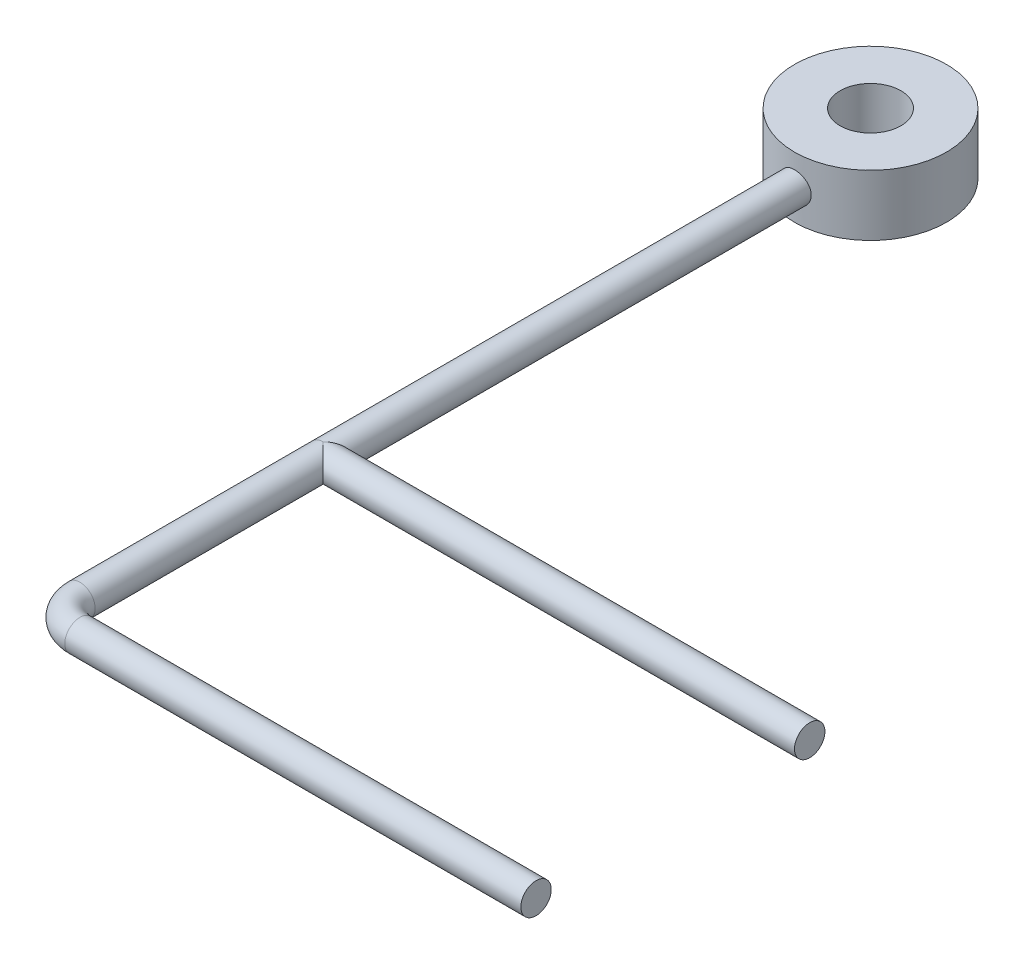
ISO-10303-21;
HEADER;
FILE_DESCRIPTION(('STEP AP214'),'2;1');
FILE_NAME('part.step','',(''),(''),'','','');
FILE_SCHEMA(('AUTOMOTIVE_DESIGN { 1 0 10303 214 1 1 1 1 }'));
ENDSEC;
DATA;
#1=APPLICATION_CONTEXT('core data for automotive mechanical design processes');
#2=APPLICATION_PROTOCOL_DEFINITION('international standard','automotive_design',2000,#1);
#3=PRODUCT_CONTEXT('',#1,'mechanical');
#4=PRODUCT('Part','Part','',(#3));
#5=PRODUCT_RELATED_PRODUCT_CATEGORY('part','',(#4));
#6=PRODUCT_DEFINITION_FORMATION('','',#4);
#7=PRODUCT_DEFINITION_CONTEXT('part definition',#1,'design');
#8=PRODUCT_DEFINITION('design','',#6,#7);
#9=PRODUCT_DEFINITION_SHAPE('','',#8);
#10=(LENGTH_UNIT() NAMED_UNIT(*) SI_UNIT(.MILLI.,.METRE.));
#11=(NAMED_UNIT(*) PLANE_ANGLE_UNIT() SI_UNIT($,.RADIAN.));
#12=(NAMED_UNIT(*) SI_UNIT($,.STERADIAN.) SOLID_ANGLE_UNIT());
#13=UNCERTAINTY_MEASURE_WITH_UNIT(LENGTH_MEASURE(1.E-05),#10,'distance_accuracy_value','');
#14=(GEOMETRIC_REPRESENTATION_CONTEXT(3) GLOBAL_UNCERTAINTY_ASSIGNED_CONTEXT((#13)) GLOBAL_UNIT_ASSIGNED_CONTEXT((#10,
#11,#12)) REPRESENTATION_CONTEXT('',''));
#15=CARTESIAN_POINT('',(0.,0.,0.));
#16=DIRECTION('',(0.,0.,1.));
#17=DIRECTION('',(1.,0.,0.));
#18=AXIS2_PLACEMENT_3D('',#15,#16,#17);
#19=CARTESIAN_POINT('',(80.,0.,135.));
#20=DIRECTION('',(1.,0.,0.));
#21=DIRECTION('',(0.,0.,-1.));
#22=AXIS2_PLACEMENT_3D('',#19,#20,#21);
#23=PLANE('',#22);
#24=CARTESIAN_POINT('',(80.,0.,135.));
#25=DIRECTION('',(1.,0.,0.));
#26=DIRECTION('',(0.,0.,-1.));
#27=AXIS2_PLACEMENT_3D('',#24,#25,#26);
#28=CIRCLE('',#27,2.5);
#29=CARTESIAN_POINT('',(80.,0.,132.5));
#30=VERTEX_POINT('',#29);
#31=EDGE_CURVE('E69',#30,#30,#28,.T.);
#32=ORIENTED_EDGE('',*,*,#31,.T.);
#33=EDGE_LOOP('',(#32));
#34=FACE_BOUND('',#33,.T.);
#35=ADVANCED_FACE('F36',(#34),#23,.T.);
#36=CARTESIAN_POINT('',(0.,0.,0.));
#37=DIRECTION('',(0.,0.,1.));
#38=DIRECTION('',(1.,0.,0.));
#39=AXIS2_PLACEMENT_3D('',#36,#37,#38);
#40=CYLINDRICAL_SURFACE('',#39,2.5);
#41=CARTESIAN_POINT('',(2.5,0.,12.2474487139159));
#42=CARTESIAN_POINT('',(2.49999486468817,-0.138910938727889,12.2474514756662));
#43=CARTESIAN_POINT('',(2.48838292929536,-0.27788655833335,12.2498377067175));
#44=CARTESIAN_POINT('',(2.4422807089571,-0.551906262857828,12.2591107826219));
#45=CARTESIAN_POINT('',(2.40777211767623,-0.686947111589948,12.2660012286197));
#46=CARTESIAN_POINT('',(2.31698945654936,-0.949093258385525,12.2834718430464));
#47=CARTESIAN_POINT('',(2.26073703538155,-1.07620630383147,12.2940483405269));
#48=CARTESIAN_POINT('',(2.12812276917626,-1.31918711174239,12.3176949870165));
#49=CARTESIAN_POINT('',(2.05176204650287,-1.43505550134475,12.3307649968365));
#50=CARTESIAN_POINT('',(1.87994768913359,-1.65390250963465,12.3581324923563));
#51=CARTESIAN_POINT('',(1.78426413978329,-1.75669896970993,12.3724434459312));
#52=CARTESIAN_POINT('',(1.57701697255327,-1.94489383394745,12.400561807565));
#53=CARTESIAN_POINT('',(1.46545224244496,-2.03029101854298,12.4143691802708));
#54=CARTESIAN_POINT('',(1.22840338981064,-2.18197004407114,12.4400699104391));
#55=CARTESIAN_POINT('',(1.10280641918053,-2.24807878454159,12.4519455360388));
#56=CARTESIAN_POINT('',(0.842010375968179,-2.35818734262034,12.4722934220908));
#57=CARTESIAN_POINT('',(0.706812203551383,-2.40218922975247,12.480766001103));
#58=CARTESIAN_POINT('',(0.432541933196237,-2.46626798404906,12.4932580172105));
#59=CARTESIAN_POINT('',(0.293544348037036,-2.48665244392751,12.4973346572032));
#60=CARTESIAN_POINT('',(0.0140464210938425,-2.50387737959578,12.5007730295901));
#61=CARTESIAN_POINT('',(-0.126453774579606,-2.50072012411455,12.500135216319));
#62=CARTESIAN_POINT('',(-0.402855001858969,-2.47118454946111,12.4942608717129));
#63=CARTESIAN_POINT('',(-0.538793035746173,-2.44513755708038,12.489089959146));
#64=CARTESIAN_POINT('',(-0.80432906645075,-2.37108741885277,12.4748044289852));
#65=CARTESIAN_POINT('',(-0.93392680936782,-2.32308339452031,12.465689653601));
#66=CARTESIAN_POINT('',(-1.18404865800221,-2.20617489963183,12.444432400499));
#67=CARTESIAN_POINT('',(-1.30451043533475,-2.13714062223778,12.4322712043806));
#68=CARTESIAN_POINT('',(-1.53226261464939,-1.9802273069085,12.4062617368446));
#69=CARTESIAN_POINT('',(-1.6395514988125,-1.89234610057371,12.3924132713806));
#70=CARTESIAN_POINT('',(-1.83987857763364,-1.69841594472882,12.3642741091115));
#71=CARTESIAN_POINT('',(-1.93263579143407,-1.59207703317602,12.3499799114379));
#72=CARTESIAN_POINT('',(-2.09904623294201,-1.36520889387312,12.322789289969));
#73=CARTESIAN_POINT('',(-2.17269909931937,-1.24467939779201,12.3098928926137));
#74=CARTESIAN_POINT('',(-2.2989070370047,-0.992447920445486,12.2869511868231));
#75=CARTESIAN_POINT('',(-2.35141661944427,-0.860722580900844,12.2769120390887));
#76=CARTESIAN_POINT('',(-2.43347585406895,-0.590071690690021,12.2609119080318));
#77=CARTESIAN_POINT('',(-2.4630284986416,-0.451147080952289,12.2549503932107));
#78=CARTESIAN_POINT('',(-2.49791501509012,-0.172587855002388,12.2478869816957));
#79=CARTESIAN_POINT('',(-2.50365464724477,-0.0330060642241485,12.2467036764289));
#80=CARTESIAN_POINT('',(-2.49184407077684,0.245120557999208,12.2491121422213));
#81=CARTESIAN_POINT('',(-2.4742951828061,0.383665447797157,12.2527036425097));
#82=CARTESIAN_POINT('',(-2.41675552018539,0.654421600730587,12.2641808123729));
#83=CARTESIAN_POINT('',(-2.37698155209824,0.786680857589406,12.2720249753624));
#84=CARTESIAN_POINT('',(-2.27635258827129,1.04265819757185,12.2910872337916));
#85=CARTESIAN_POINT('',(-2.21549585593294,1.1663755760893,12.3023056071567));
#86=CARTESIAN_POINT('',(-2.07351035553899,1.4035327748754,12.327035149051));
#87=CARTESIAN_POINT('',(-1.99212769495688,1.51681761575206,12.3405742966226));
#88=CARTESIAN_POINT('',(-1.81173893053178,1.72827078000228,12.3683430956659));
#89=CARTESIAN_POINT('',(-1.71273101286134,1.82643754562313,12.3825728180955));
#90=CARTESIAN_POINT('',(-1.49808068374472,2.00640639796394,12.4103836467304));
#91=CARTESIAN_POINT('',(-1.38220624732407,2.08793413662499,12.4239514427171));
#92=CARTESIAN_POINT('',(-1.13816974158689,2.23036470374895,12.4486781907155));
#93=CARTESIAN_POINT('',(-1.01000818858377,2.29126839836195,12.4598372438803));
#94=CARTESIAN_POINT('',(-0.745756702060031,2.39032217936658,12.4784323515267));
#95=CARTESIAN_POINT('',(-0.609716683695195,2.42860129556563,12.4858894785651));
#96=CARTESIAN_POINT('',(-0.332973636699779,2.48172811915961,12.4963308984415));
#97=CARTESIAN_POINT('',(-0.192271171778029,2.49657864868919,12.4993157299962));
#98=CARTESIAN_POINT('',(0.0871822347590524,2.50231745240722,12.5004635113529));
#99=CARTESIAN_POINT('',(0.225924530353734,2.49361820114056,12.4987094637332));
#100=CARTESIAN_POINT('',(0.499927578289124,2.45341512363043,12.4907510890085));
#101=CARTESIAN_POINT('',(0.635188374384305,2.42191158412967,12.4845468178608));
#102=CARTESIAN_POINT('',(0.89813187436266,2.33717751977103,12.468387459123));
#103=CARTESIAN_POINT('',(1.02583110810041,2.28399655467256,12.4584409311904));
#104=CARTESIAN_POINT('',(1.27055305046517,2.15746939667222,12.435868053092));
#105=CARTESIAN_POINT('',(1.38757491441961,2.08412161023875,12.4232414911747));
#106=CARTESIAN_POINT('',(1.60965972526479,1.91795153234678,12.3964399789185));
#107=CARTESIAN_POINT('',(1.71449929028711,1.82483415904056,12.3822433354475));
#108=CARTESIAN_POINT('',(1.90720654439626,1.62237439975307,12.3540305726966));
#109=CARTESIAN_POINT('',(1.99507020802228,1.51302817630018,12.340014496968));
#110=CARTESIAN_POINT('',(2.15223054862495,1.27980170827392,12.3135835683483));
#111=CARTESIAN_POINT('',(2.22131703654522,1.15577759719687,12.3011875892806));
#112=CARTESIAN_POINT('',(2.33756012316556,0.897668066849745,12.2796309281603));
#113=CARTESIAN_POINT('',(2.3847366149354,0.763591903282023,12.2704673131246));
#114=CARTESIAN_POINT('',(2.44667284964413,0.524343861392814,12.2582420284461));
#115=CARTESIAN_POINT('',(2.46663474630921,0.420536451215105,12.2542196228652));
#116=CARTESIAN_POINT('',(2.49330004489927,0.211165113622163,12.2488219614771));
#117=CARTESIAN_POINT('',(2.5000039039066,0.105601246888829,12.2474466144105));
#118=CARTESIAN_POINT('',(2.5,0.,12.2474487139159));
#119=B_SPLINE_CURVE_WITH_KNOTS('',3,(#41,#42,#43,#44,#45,#46,#47,#48,#49,#50,#51,#52,#53,#54,
#55,#56,#57,#58,#59,#60,#61,#62,#63,#64,#65,#66,#67,#68,#69,#70,#71,#72,#73,#74,#75,#76,#77,#78,
#79,#80,#81,#82,#83,#84,#85,#86,#87,#88,#89,#90,#91,#92,#93,#94,#95,#96,#97,#98,#99,#100,#101,
#102,#103,#104,#105,#106,#107,#108,#109,#110,#111,#112,#113,#114,#115,#116,#117,#118),
.UNSPECIFIED.,.T.,.F.,(4,2,2,2,2,2,2,2,2,2,2,2,2,2,2,2,2,2,2,2,2,2,2,2,2,2,2,2,2,2,2,2,2,2,2,2,
2,2,4),(0.,0.416346159673569,0.833025598210739,1.24929124485146,1.66553366214966,
2.08705631371091,2.50860850088554,2.93383501093625,3.35902170616399,3.778606222077,
4.1981503029062,4.61171974083843,5.02530572684374,5.44149810555757,5.85773839425164,
6.28123366906207,6.70473695306799,7.1291465793194,7.5535008754006,7.97059394511482,
8.38766336321052,8.80073354458295,9.21383775885994,9.632326494363,10.0508583217552,
10.4758150433362,10.9007539157526,11.3232453394662,11.7456858672907,12.1607754353671,
12.5758597841689,12.9900004268863,13.4041738033671,13.8250288006399,14.2459834722445,
14.6714724644901,15.0965743772549,15.413095090954,15.729604892137),.UNSPECIFIED.);
#120=CARTESIAN_POINT('',(2.5,0.,12.2474487139159));
#121=VERTEX_POINT('',#120);
#122=EDGE_CURVE('E11',#121,#121,#119,.T.);
#123=ORIENTED_EDGE('',*,*,#122,.F.);
#124=EDGE_LOOP('',(#123));
#125=FACE_BOUND('',#124,.T.);
#126=CARTESIAN_POINT('',(0.,0.,90.));
#127=DIRECTION('',(0.707106781186548,0.,0.707106781186547));
#128=DIRECTION('',(-0.707106781186548,0.,0.707106781186547));
#129=AXIS2_PLACEMENT_3D('',#126,#127,#128);
#130=ELLIPSE('',#129,3.53553390593273,2.5);
#131=CARTESIAN_POINT('',(0.,-2.5,90.));
#132=VERTEX_POINT('',#131);
#133=CARTESIAN_POINT('',(0.,2.5,90.));
#134=VERTEX_POINT('',#133);
#135=EDGE_CURVE('E62',#132,#134,#130,.T.);
#136=ORIENTED_EDGE('',*,*,#135,.F.);
#137=CARTESIAN_POINT('',(0.,0.,90.));
#138=DIRECTION('',(0.,0.,1.));
#139=DIRECTION('',(1.,0.,0.));
#140=AXIS2_PLACEMENT_3D('',#137,#138,#139);
#141=CIRCLE('',#140,2.5);
#142=EDGE_CURVE('E55',#134,#132,#141,.T.);
#143=ORIENTED_EDGE('',*,*,#142,.F.);
#144=EDGE_LOOP('',(#136,#143));
#145=FACE_BOUND('',#144,.T.);
#146=ADVANCED_FACE('F64',(#125,#145),#40,.T.);
#147=CARTESIAN_POINT('',(0.,0.,90.));
#148=DIRECTION('',(0.,0.,1.));
#149=DIRECTION('',(1.,0.,0.));
#150=AXIS2_PLACEMENT_3D('',#147,#148,#149);
#151=CYLINDRICAL_SURFACE('',#150,2.5);
#152=CARTESIAN_POINT('',(0.,0.,90.));
#153=DIRECTION('',(-0.707106781186547,0.,0.707106781186548));
#154=DIRECTION('',(0.707106781186548,0.,0.707106781186547));
#155=AXIS2_PLACEMENT_3D('',#152,#153,#154);
#156=ELLIPSE('',#155,3.53553390593273,2.5);
#157=EDGE_CURVE('E48',#134,#132,#156,.F.);
#158=ORIENTED_EDGE('',*,*,#157,.F.);
#159=ORIENTED_EDGE('',*,*,#142,.T.);
#160=EDGE_LOOP('',(#158,#159));
#161=FACE_BOUND('',#160,.T.);
#162=CARTESIAN_POINT('',(0.,0.,130.));
#163=DIRECTION('',(0.,0.,1.));
#164=DIRECTION('',(1.,0.,0.));
#165=AXIS2_PLACEMENT_3D('',#162,#163,#164);
#166=CIRCLE('',#165,2.5);
#167=CARTESIAN_POINT('',(-2.5,0.,130.));
#168=VERTEX_POINT('',#167);
#169=EDGE_CURVE('E61',#168,#168,#166,.T.);
#170=ORIENTED_EDGE('',*,*,#169,.F.);
#171=EDGE_LOOP('',(#170));
#172=FACE_BOUND('',#171,.T.);
#173=ADVANCED_FACE('F57',(#161,#172),#151,.T.);
#174=CARTESIAN_POINT('',(5.,0.,130.));
#175=DIRECTION('',(0.,1.,0.));
#176=DIRECTION('',(0.,0.,1.));
#177=AXIS2_PLACEMENT_3D('',#174,#175,#176);
#178=TOROIDAL_SURFACE('',#177,5.,2.5);
#179=CARTESIAN_POINT('',(5.,0.,135.));
#180=DIRECTION('',(1.,0.,0.));
#181=DIRECTION('',(0.,0.,-1.));
#182=AXIS2_PLACEMENT_3D('',#179,#180,#181);
#183=CIRCLE('',#182,2.5);
#184=CARTESIAN_POINT('',(5.,0.,137.5));
#185=VERTEX_POINT('',#184);
#186=EDGE_CURVE('E71',#185,#185,#183,.T.);
#187=CARTESIAN_POINT('',(5.,0.,130.));
#188=DIRECTION('',(0.,1.,0.));
#189=DIRECTION('',(0.,0.,1.));
#190=AXIS2_PLACEMENT_3D('',#187,#188,#189);
#191=CIRCLE('',#190,7.5);
#192=EDGE_CURVE('',#168,#185,#191,.T.);
#193=ORIENTED_EDGE('',*,*,#169,.T.);
#194=ORIENTED_EDGE('',*,*,#186,.F.);
#195=ORIENTED_EDGE('',*,*,#192,.T.);
#196=ORIENTED_EDGE('',*,*,#192,.F.);
#197=EDGE_LOOP('',(#193,#195,#194,#196));
#198=FACE_BOUND('',#197,.T.);
#199=ADVANCED_FACE('F126',(#198),#178,.T.);
#200=CARTESIAN_POINT('',(5.,0.,135.));
#201=DIRECTION('',(1.,0.,0.));
#202=DIRECTION('',(0.,0.,-1.));
#203=AXIS2_PLACEMENT_3D('',#200,#201,#202);
#204=CYLINDRICAL_SURFACE('',#203,2.5);
#205=ORIENTED_EDGE('',*,*,#31,.F.);
#206=EDGE_LOOP('',(#205));
#207=FACE_BOUND('',#206,.T.);
#208=ORIENTED_EDGE('',*,*,#186,.T.);
#209=EDGE_LOOP('',(#208));
#210=FACE_BOUND('',#209,.T.);
#211=ADVANCED_FACE('F122',(#207,#210),#204,.T.);
#212=CARTESIAN_POINT('',(80.,0.,90.));
#213=DIRECTION('',(1.,0.,0.));
#214=DIRECTION('',(0.,0.,-1.));
#215=AXIS2_PLACEMENT_3D('',#212,#213,#214);
#216=PLANE('',#215);
#217=CARTESIAN_POINT('',(80.,0.,90.));
#218=DIRECTION('',(1.,0.,0.));
#219=DIRECTION('',(0.,0.,-1.));
#220=AXIS2_PLACEMENT_3D('',#217,#218,#219);
#221=CIRCLE('',#220,2.5);
#222=CARTESIAN_POINT('',(80.,0.,87.5));
#223=VERTEX_POINT('',#222);
#224=EDGE_CURVE('E66',#223,#223,#221,.T.);
#225=ORIENTED_EDGE('',*,*,#224,.T.);
#226=EDGE_LOOP('',(#225));
#227=FACE_BOUND('',#226,.T.);
#228=ADVANCED_FACE('F111',(#227),#216,.T.);
#229=CARTESIAN_POINT('',(0.,0.,90.));
#230=DIRECTION('',(1.,0.,0.));
#231=DIRECTION('',(0.,0.,-1.));
#232=AXIS2_PLACEMENT_3D('',#229,#230,#231);
#233=CYLINDRICAL_SURFACE('',#232,2.5);
#234=ORIENTED_EDGE('',*,*,#224,.F.);
#235=EDGE_LOOP('',(#234));
#236=FACE_BOUND('',#235,.T.);
#237=ORIENTED_EDGE('',*,*,#157,.T.);
#238=ORIENTED_EDGE('',*,*,#135,.T.);
#239=EDGE_LOOP('',(#237,#238));
#240=FACE_BOUND('',#239,.T.);
#241=ADVANCED_FACE('F68',(#236,#240),#233,.T.);
#242=CARTESIAN_POINT('',(0.,-5.,0.));
#243=DIRECTION('',(0.,1.,0.));
#244=DIRECTION('',(0.,0.,1.));
#245=AXIS2_PLACEMENT_3D('',#242,#243,#244);
#246=CYLINDRICAL_SURFACE('',#245,12.5);
#247=ORIENTED_EDGE('',*,*,#122,.T.);
#248=EDGE_LOOP('',(#247));
#249=FACE_BOUND('',#248,.T.);
#250=CARTESIAN_POINT('',(0.,-5.,0.));
#251=DIRECTION('',(0.,1.,0.));
#252=DIRECTION('',(0.,0.,1.));
#253=AXIS2_PLACEMENT_3D('',#250,#251,#252);
#254=CIRCLE('',#253,12.5);
#255=CARTESIAN_POINT('',(0.,-5.,12.5));
#256=VERTEX_POINT('',#255);
#257=EDGE_CURVE('E80',#256,#256,#254,.T.);
#258=ORIENTED_EDGE('',*,*,#257,.T.);
#259=EDGE_LOOP('',(#258));
#260=FACE_BOUND('',#259,.T.);
#261=CARTESIAN_POINT('',(0.,5.,0.));
#262=DIRECTION('',(0.,1.,0.));
#263=DIRECTION('',(0.,0.,1.));
#264=AXIS2_PLACEMENT_3D('',#261,#262,#263);
#265=CIRCLE('',#264,12.5);
#266=CARTESIAN_POINT('',(0.,5.,12.5));
#267=VERTEX_POINT('',#266);
#268=EDGE_CURVE('E83',#267,#267,#265,.T.);
#269=ORIENTED_EDGE('',*,*,#268,.F.);
#270=EDGE_LOOP('',(#269));
#271=FACE_BOUND('',#270,.T.);
#272=ADVANCED_FACE('F108',(#249,#260,#271),#246,.T.);
#273=CARTESIAN_POINT('',(0.,-5.,0.));
#274=DIRECTION('',(0.,1.,0.));
#275=DIRECTION('',(0.,0.,1.));
#276=AXIS2_PLACEMENT_3D('',#273,#274,#275);
#277=PLANE('',#276);
#278=CARTESIAN_POINT('',(0.,-5.,0.));
#279=DIRECTION('',(0.,1.,0.));
#280=DIRECTION('',(0.,0.,1.));
#281=AXIS2_PLACEMENT_3D('',#278,#279,#280);
#282=CIRCLE('',#281,5.);
#283=CARTESIAN_POINT('',(0.,-5.,5.));
#284=VERTEX_POINT('',#283);
#285=EDGE_CURVE('E86',#284,#284,#282,.T.);
#286=ORIENTED_EDGE('',*,*,#285,.T.);
#287=EDGE_LOOP('',(#286));
#288=FACE_BOUND('',#287,.T.);
#289=ORIENTED_EDGE('',*,*,#257,.F.);
#290=EDGE_LOOP('',(#289));
#291=FACE_BOUND('',#290,.T.);
#292=ADVANCED_FACE('F93',(#288,#291),#277,.F.);
#293=CARTESIAN_POINT('',(0.,5.,0.));
#294=DIRECTION('',(0.,1.,0.));
#295=DIRECTION('',(0.,0.,1.));
#296=AXIS2_PLACEMENT_3D('',#293,#294,#295);
#297=PLANE('',#296);
#298=CARTESIAN_POINT('',(0.,5.,0.));
#299=DIRECTION('',(0.,1.,0.));
#300=DIRECTION('',(0.,0.,1.));
#301=AXIS2_PLACEMENT_3D('',#298,#299,#300);
#302=CIRCLE('',#301,5.);
#303=CARTESIAN_POINT('',(0.,5.,5.));
#304=VERTEX_POINT('',#303);
#305=EDGE_CURVE('E87',#304,#304,#302,.T.);
#306=ORIENTED_EDGE('',*,*,#305,.F.);
#307=EDGE_LOOP('',(#306));
#308=FACE_BOUND('',#307,.T.);
#309=ORIENTED_EDGE('',*,*,#268,.T.);
#310=EDGE_LOOP('',(#309));
#311=FACE_BOUND('',#310,.T.);
#312=ADVANCED_FACE('F99',(#308,#311),#297,.T.);
#313=CARTESIAN_POINT('',(0.,-5.,0.));
#314=DIRECTION('',(0.,1.,0.));
#315=DIRECTION('',(0.,0.,1.));
#316=AXIS2_PLACEMENT_3D('',#313,#314,#315);
#317=CYLINDRICAL_SURFACE('',#316,5.);
#318=ORIENTED_EDGE('',*,*,#285,.F.);
#319=EDGE_LOOP('',(#318));
#320=FACE_BOUND('',#319,.T.);
#321=ORIENTED_EDGE('',*,*,#305,.T.);
#322=EDGE_LOOP('',(#321));
#323=FACE_BOUND('',#322,.T.);
#324=ADVANCED_FACE('F96',(#320,#323),#317,.F.);
#325=CLOSED_SHELL('',(#35,#146,#173,#199,#211,#228,#241,#272,#292,#312,#324));
#326=MANIFOLD_SOLID_BREP('B2',#325);
#327=ADVANCED_BREP_SHAPE_REPRESENTATION('',(#18,#326),#14);
#328=SHAPE_DEFINITION_REPRESENTATION(#9,#327);
ENDSEC;
END-ISO-10303-21;
